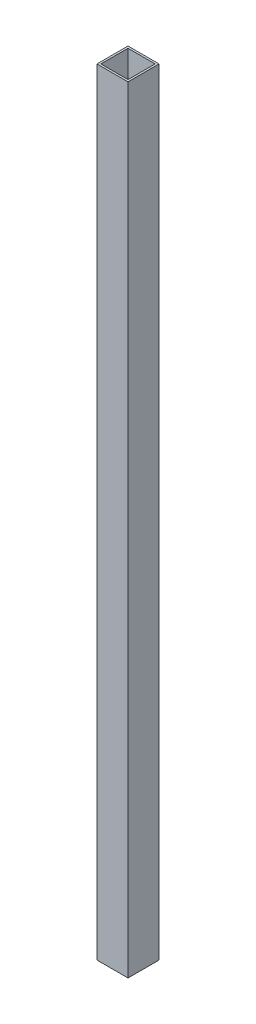
ISO-10303-21;
HEADER;
FILE_DESCRIPTION(('STEP AP214'),'2;1');
FILE_NAME('part.step','',(''),(''),'','','');
FILE_SCHEMA(('AUTOMOTIVE_DESIGN { 1 0 10303 214 1 1 1 1 }'));
ENDSEC;
DATA;
#1=APPLICATION_CONTEXT('core data for automotive mechanical design processes');
#2=APPLICATION_PROTOCOL_DEFINITION('international standard','automotive_design',2000,#1);
#3=PRODUCT_CONTEXT('',#1,'mechanical');
#4=PRODUCT('Part','Part','',(#3));
#5=PRODUCT_RELATED_PRODUCT_CATEGORY('part','',(#4));
#6=PRODUCT_DEFINITION_FORMATION('','',#4);
#7=PRODUCT_DEFINITION_CONTEXT('part definition',#1,'design');
#8=PRODUCT_DEFINITION('design','',#6,#7);
#9=PRODUCT_DEFINITION_SHAPE('','',#8);
#10=(LENGTH_UNIT() NAMED_UNIT(*) SI_UNIT(.MILLI.,.METRE.));
#11=(NAMED_UNIT(*) PLANE_ANGLE_UNIT() SI_UNIT($,.RADIAN.));
#12=(NAMED_UNIT(*) SI_UNIT($,.STERADIAN.) SOLID_ANGLE_UNIT());
#13=UNCERTAINTY_MEASURE_WITH_UNIT(LENGTH_MEASURE(1.E-05),#10,'distance_accuracy_value','');
#14=(GEOMETRIC_REPRESENTATION_CONTEXT(3) GLOBAL_UNCERTAINTY_ASSIGNED_CONTEXT((#13)) GLOBAL_UNIT_ASSIGNED_CONTEXT((#10,
#11,#12)) REPRESENTATION_CONTEXT('',''));
#15=CARTESIAN_POINT('',(0.,0.,0.));
#16=DIRECTION('',(0.,0.,1.));
#17=DIRECTION('',(1.,0.,0.));
#18=AXIS2_PLACEMENT_3D('',#15,#16,#17);
#19=CARTESIAN_POINT('',(-12.7,0.,12.7));
#20=DIRECTION('',(0.,-1.,0.));
#21=DIRECTION('',(0.,0.,-1.));
#22=AXIS2_PLACEMENT_3D('',#19,#20,#21);
#23=PLANE('',#22);
#24=DIRECTION('',(-1.,0.,0.));
#25=VECTOR('',#24,1.);
#26=CARTESIAN_POINT('',(0.,0.,11.1125));
#27=LINE('',#26,#25);
#28=CARTESIAN_POINT('',(11.1125,0.,11.1125));
#29=VERTEX_POINT('',#28);
#30=CARTESIAN_POINT('',(-11.1125,0.,11.1125));
#31=VERTEX_POINT('',#30);
#32=EDGE_CURVE('E108',#29,#31,#27,.T.);
#33=ORIENTED_EDGE('',*,*,#32,.F.);
#34=DIRECTION('',(0.,0.,1.));
#35=VECTOR('',#34,1.);
#36=CARTESIAN_POINT('',(11.1125,0.,0.));
#37=LINE('',#36,#35);
#38=CARTESIAN_POINT('',(11.1125,0.,-11.1125));
#39=VERTEX_POINT('',#38);
#40=EDGE_CURVE('E110',#39,#29,#37,.T.);
#41=ORIENTED_EDGE('',*,*,#40,.F.);
#42=DIRECTION('',(1.,0.,0.));
#43=VECTOR('',#42,1.);
#44=CARTESIAN_POINT('',(0.,0.,-11.1125));
#45=LINE('',#44,#43);
#46=CARTESIAN_POINT('',(-11.1125,0.,-11.1125));
#47=VERTEX_POINT('',#46);
#48=EDGE_CURVE('E114',#47,#39,#45,.T.);
#49=ORIENTED_EDGE('',*,*,#48,.F.);
#50=DIRECTION('',(0.,0.,-1.));
#51=VECTOR('',#50,1.);
#52=CARTESIAN_POINT('',(-11.1125,0.,0.));
#53=LINE('',#52,#51);
#54=EDGE_CURVE('E118',#31,#47,#53,.T.);
#55=ORIENTED_EDGE('',*,*,#54,.F.);
#56=EDGE_LOOP('',(#33,#41,#49,#55));
#57=FACE_BOUND('',#56,.T.);
#58=DIRECTION('',(0.,0.,1.));
#59=VECTOR('',#58,1.);
#60=CARTESIAN_POINT('',(12.7,0.,0.));
#61=LINE('',#60,#59);
#62=CARTESIAN_POINT('',(12.7,0.,-12.7));
#63=VERTEX_POINT('',#62);
#64=CARTESIAN_POINT('',(12.7,0.,12.7));
#65=VERTEX_POINT('',#64);
#66=EDGE_CURVE('E78',#63,#65,#61,.T.);
#67=ORIENTED_EDGE('',*,*,#66,.T.);
#68=DIRECTION('',(-1.,0.,0.));
#69=VECTOR('',#68,1.);
#70=CARTESIAN_POINT('',(0.,0.,12.7));
#71=LINE('',#70,#69);
#72=CARTESIAN_POINT('',(-12.7,0.,12.7));
#73=VERTEX_POINT('',#72);
#74=EDGE_CURVE('E100',#65,#73,#71,.T.);
#75=ORIENTED_EDGE('',*,*,#74,.T.);
#76=DIRECTION('',(0.,0.,-1.));
#77=VECTOR('',#76,1.);
#78=CARTESIAN_POINT('',(-12.7,0.,0.));
#79=LINE('',#78,#77);
#80=CARTESIAN_POINT('',(-12.7,0.,-12.7));
#81=VERTEX_POINT('',#80);
#82=EDGE_CURVE('E82',#73,#81,#79,.T.);
#83=ORIENTED_EDGE('',*,*,#82,.T.);
#84=DIRECTION('',(1.,0.,0.));
#85=VECTOR('',#84,1.);
#86=CARTESIAN_POINT('',(0.,0.,-12.7));
#87=LINE('',#86,#85);
#88=EDGE_CURVE('E20',#81,#63,#87,.T.);
#89=ORIENTED_EDGE('',*,*,#88,.T.);
#90=EDGE_LOOP('',(#67,#75,#83,#89));
#91=FACE_BOUND('',#90,.T.);
#92=ADVANCED_FACE('F16',(#57,#91),#23,.T.);
#93=CARTESIAN_POINT('',(-12.7,0.,-12.7));
#94=DIRECTION('',(0.,0.,1.));
#95=DIRECTION('',(1.,0.,0.));
#96=AXIS2_PLACEMENT_3D('',#93,#94,#95);
#97=PLANE('',#96);
#98=DIRECTION('',(0.,1.,0.));
#99=VECTOR('',#98,1.);
#100=CARTESIAN_POINT('',(-12.7,317.5,-12.7));
#101=LINE('',#100,#99);
#102=CARTESIAN_POINT('',(-12.7,635.,-12.7));
#103=VERTEX_POINT('',#102);
#104=EDGE_CURVE('E102',#81,#103,#101,.T.);
#105=ORIENTED_EDGE('',*,*,#104,.T.);
#106=DIRECTION('',(1.,0.,0.));
#107=VECTOR('',#106,1.);
#108=CARTESIAN_POINT('',(0.,635.,-12.7));
#109=LINE('',#108,#107);
#110=CARTESIAN_POINT('',(12.7,635.,-12.7));
#111=VERTEX_POINT('',#110);
#112=EDGE_CURVE('E97',#103,#111,#109,.T.);
#113=ORIENTED_EDGE('',*,*,#112,.T.);
#114=DIRECTION('',(0.,-1.,0.));
#115=VECTOR('',#114,1.);
#116=CARTESIAN_POINT('',(12.7,317.5,-12.7));
#117=LINE('',#116,#115);
#118=EDGE_CURVE('E87',#111,#63,#117,.T.);
#119=ORIENTED_EDGE('',*,*,#118,.T.);
#120=ORIENTED_EDGE('',*,*,#88,.F.);
#121=EDGE_LOOP('',(#105,#113,#119,#120));
#122=FACE_BOUND('',#121,.T.);
#123=ADVANCED_FACE('F96',(#122),#97,.F.);
#124=CARTESIAN_POINT('',(12.7,0.,-12.7));
#125=DIRECTION('',(-1.,0.,0.));
#126=DIRECTION('',(0.,0.,1.));
#127=AXIS2_PLACEMENT_3D('',#124,#125,#126);
#128=PLANE('',#127);
#129=ORIENTED_EDGE('',*,*,#118,.F.);
#130=DIRECTION('',(0.,0.,1.));
#131=VECTOR('',#130,1.);
#132=CARTESIAN_POINT('',(12.7,635.,0.));
#133=LINE('',#132,#131);
#134=CARTESIAN_POINT('',(12.7,635.,12.7));
#135=VERTEX_POINT('',#134);
#136=EDGE_CURVE('E125',#111,#135,#133,.T.);
#137=ORIENTED_EDGE('',*,*,#136,.T.);
#138=DIRECTION('',(0.,-1.,0.));
#139=VECTOR('',#138,1.);
#140=CARTESIAN_POINT('',(12.7,317.5,12.7));
#141=LINE('',#140,#139);
#142=EDGE_CURVE('E93',#135,#65,#141,.T.);
#143=ORIENTED_EDGE('',*,*,#142,.T.);
#144=ORIENTED_EDGE('',*,*,#66,.F.);
#145=EDGE_LOOP('',(#129,#137,#143,#144));
#146=FACE_BOUND('',#145,.T.);
#147=ADVANCED_FACE('F90',(#146),#128,.F.);
#148=CARTESIAN_POINT('',(12.7,0.,12.7));
#149=DIRECTION('',(0.,0.,-1.));
#150=DIRECTION('',(-1.,0.,0.));
#151=AXIS2_PLACEMENT_3D('',#148,#149,#150);
#152=PLANE('',#151);
#153=ORIENTED_EDGE('',*,*,#142,.F.);
#154=DIRECTION('',(-1.,0.,0.));
#155=VECTOR('',#154,1.);
#156=CARTESIAN_POINT('',(0.,635.,12.7));
#157=LINE('',#156,#155);
#158=CARTESIAN_POINT('',(-12.7,635.,12.7));
#159=VERTEX_POINT('',#158);
#160=EDGE_CURVE('E127',#135,#159,#157,.T.);
#161=ORIENTED_EDGE('',*,*,#160,.T.);
#162=DIRECTION('',(0.,-1.,0.));
#163=VECTOR('',#162,1.);
#164=CARTESIAN_POINT('',(-12.7,317.5,12.7));
#165=LINE('',#164,#163);
#166=EDGE_CURVE('E104',#159,#73,#165,.T.);
#167=ORIENTED_EDGE('',*,*,#166,.T.);
#168=ORIENTED_EDGE('',*,*,#74,.F.);
#169=EDGE_LOOP('',(#153,#161,#167,#168));
#170=FACE_BOUND('',#169,.T.);
#171=ADVANCED_FACE('F172',(#170),#152,.F.);
#172=CARTESIAN_POINT('',(-12.7,0.,12.7));
#173=DIRECTION('',(1.,0.,0.));
#174=DIRECTION('',(0.,0.,-1.));
#175=AXIS2_PLACEMENT_3D('',#172,#173,#174);
#176=PLANE('',#175);
#177=ORIENTED_EDGE('',*,*,#166,.F.);
#178=DIRECTION('',(0.,0.,-1.));
#179=VECTOR('',#178,1.);
#180=CARTESIAN_POINT('',(-12.7,635.,0.));
#181=LINE('',#180,#179);
#182=EDGE_CURVE('E130',#159,#103,#181,.T.);
#183=ORIENTED_EDGE('',*,*,#182,.T.);
#184=ORIENTED_EDGE('',*,*,#104,.F.);
#185=ORIENTED_EDGE('',*,*,#82,.F.);
#186=EDGE_LOOP('',(#177,#183,#184,#185));
#187=FACE_BOUND('',#186,.T.);
#188=ADVANCED_FACE('F169',(#187),#176,.F.);
#189=CARTESIAN_POINT('',(11.1125,0.,11.1125));
#190=DIRECTION('',(0.,0.,-1.));
#191=DIRECTION('',(-1.,0.,0.));
#192=AXIS2_PLACEMENT_3D('',#189,#190,#191);
#193=PLANE('',#192);
#194=DIRECTION('',(1.,0.,0.));
#195=VECTOR('',#194,1.);
#196=CARTESIAN_POINT('',(0.,635.,11.1125));
#197=LINE('',#196,#195);
#198=CARTESIAN_POINT('',(-11.1125,635.,11.1125));
#199=VERTEX_POINT('',#198);
#200=CARTESIAN_POINT('',(11.1125,635.,11.1125));
#201=VERTEX_POINT('',#200);
#202=EDGE_CURVE('E133',#199,#201,#197,.T.);
#203=ORIENTED_EDGE('',*,*,#202,.T.);
#204=DIRECTION('',(0.,1.,0.));
#205=VECTOR('',#204,1.);
#206=CARTESIAN_POINT('',(11.1125,317.5,11.1125));
#207=LINE('',#206,#205);
#208=EDGE_CURVE('E112',#29,#201,#207,.T.);
#209=ORIENTED_EDGE('',*,*,#208,.F.);
#210=ORIENTED_EDGE('',*,*,#32,.T.);
#211=DIRECTION('',(0.,-1.,0.));
#212=VECTOR('',#211,1.);
#213=CARTESIAN_POINT('',(-11.1125,317.5,11.1125));
#214=LINE('',#213,#212);
#215=EDGE_CURVE('E121',#199,#31,#214,.T.);
#216=ORIENTED_EDGE('',*,*,#215,.F.);
#217=EDGE_LOOP('',(#203,#209,#210,#216));
#218=FACE_BOUND('',#217,.T.);
#219=ADVANCED_FACE('F153',(#218),#193,.T.);
#220=CARTESIAN_POINT('',(11.1125,0.,-11.1125));
#221=DIRECTION('',(-1.,0.,0.));
#222=DIRECTION('',(0.,0.,1.));
#223=AXIS2_PLACEMENT_3D('',#220,#221,#222);
#224=PLANE('',#223);
#225=DIRECTION('',(0.,0.,-1.));
#226=VECTOR('',#225,1.);
#227=CARTESIAN_POINT('',(11.1125,635.,0.));
#228=LINE('',#227,#226);
#229=CARTESIAN_POINT('',(11.1125,635.,-11.1125));
#230=VERTEX_POINT('',#229);
#231=EDGE_CURVE('E136',#201,#230,#228,.T.);
#232=ORIENTED_EDGE('',*,*,#231,.T.);
#233=DIRECTION('',(0.,1.,0.));
#234=VECTOR('',#233,1.);
#235=CARTESIAN_POINT('',(11.1125,317.5,-11.1125));
#236=LINE('',#235,#234);
#237=EDGE_CURVE('E116',#39,#230,#236,.T.);
#238=ORIENTED_EDGE('',*,*,#237,.F.);
#239=ORIENTED_EDGE('',*,*,#40,.T.);
#240=ORIENTED_EDGE('',*,*,#208,.T.);
#241=EDGE_LOOP('',(#232,#238,#239,#240));
#242=FACE_BOUND('',#241,.T.);
#243=ADVANCED_FACE('F148',(#242),#224,.T.);
#244=CARTESIAN_POINT('',(-11.1125,0.,-11.1125));
#245=DIRECTION('',(0.,0.,1.));
#246=DIRECTION('',(1.,0.,0.));
#247=AXIS2_PLACEMENT_3D('',#244,#245,#246);
#248=PLANE('',#247);
#249=DIRECTION('',(-1.,0.,0.));
#250=VECTOR('',#249,1.);
#251=CARTESIAN_POINT('',(0.,635.,-11.1125));
#252=LINE('',#251,#250);
#253=CARTESIAN_POINT('',(-11.1125,635.,-11.1125));
#254=VERTEX_POINT('',#253);
#255=EDGE_CURVE('E26',#230,#254,#252,.T.);
#256=ORIENTED_EDGE('',*,*,#255,.T.);
#257=DIRECTION('',(0.,1.,0.));
#258=VECTOR('',#257,1.);
#259=CARTESIAN_POINT('',(-11.1125,317.5,-11.1125));
#260=LINE('',#259,#258);
#261=EDGE_CURVE('E34',#47,#254,#260,.T.);
#262=ORIENTED_EDGE('',*,*,#261,.F.);
#263=ORIENTED_EDGE('',*,*,#48,.T.);
#264=ORIENTED_EDGE('',*,*,#237,.T.);
#265=EDGE_LOOP('',(#256,#262,#263,#264));
#266=FACE_BOUND('',#265,.T.);
#267=ADVANCED_FACE('F142',(#266),#248,.T.);
#268=CARTESIAN_POINT('',(-11.1125,0.,11.1125));
#269=DIRECTION('',(1.,0.,0.));
#270=DIRECTION('',(0.,0.,-1.));
#271=AXIS2_PLACEMENT_3D('',#268,#269,#270);
#272=PLANE('',#271);
#273=DIRECTION('',(0.,0.,1.));
#274=VECTOR('',#273,1.);
#275=CARTESIAN_POINT('',(-11.1125,635.,0.));
#276=LINE('',#275,#274);
#277=EDGE_CURVE('E11',#254,#199,#276,.T.);
#278=ORIENTED_EDGE('',*,*,#277,.T.);
#279=ORIENTED_EDGE('',*,*,#215,.T.);
#280=ORIENTED_EDGE('',*,*,#54,.T.);
#281=ORIENTED_EDGE('',*,*,#261,.T.);
#282=EDGE_LOOP('',(#278,#279,#280,#281));
#283=FACE_BOUND('',#282,.T.);
#284=ADVANCED_FACE('F156',(#283),#272,.T.);
#285=CARTESIAN_POINT('',(-12.7,635.,12.7));
#286=DIRECTION('',(0.,-1.,0.));
#287=DIRECTION('',(0.,0.,-1.));
#288=AXIS2_PLACEMENT_3D('',#285,#286,#287);
#289=PLANE('',#288);
#290=ORIENTED_EDGE('',*,*,#255,.F.);
#291=ORIENTED_EDGE('',*,*,#231,.F.);
#292=ORIENTED_EDGE('',*,*,#202,.F.);
#293=ORIENTED_EDGE('',*,*,#277,.F.);
#294=EDGE_LOOP('',(#290,#291,#292,#293));
#295=FACE_BOUND('',#294,.T.);
#296=ORIENTED_EDGE('',*,*,#160,.F.);
#297=ORIENTED_EDGE('',*,*,#136,.F.);
#298=ORIENTED_EDGE('',*,*,#112,.F.);
#299=ORIENTED_EDGE('',*,*,#182,.F.);
#300=EDGE_LOOP('',(#296,#297,#298,#299));
#301=FACE_BOUND('',#300,.T.);
#302=ADVANCED_FACE('F18',(#295,#301),#289,.F.);
#303=CLOSED_SHELL('',(#92,#123,#147,#171,#188,#219,#243,#267,#284,#302));
#304=MANIFOLD_SOLID_BREP('B1',#303);
#305=ADVANCED_BREP_SHAPE_REPRESENTATION('',(#18,#304),#14);
#306=SHAPE_DEFINITION_REPRESENTATION(#9,#305);
ENDSEC;
END-ISO-10303-21;
